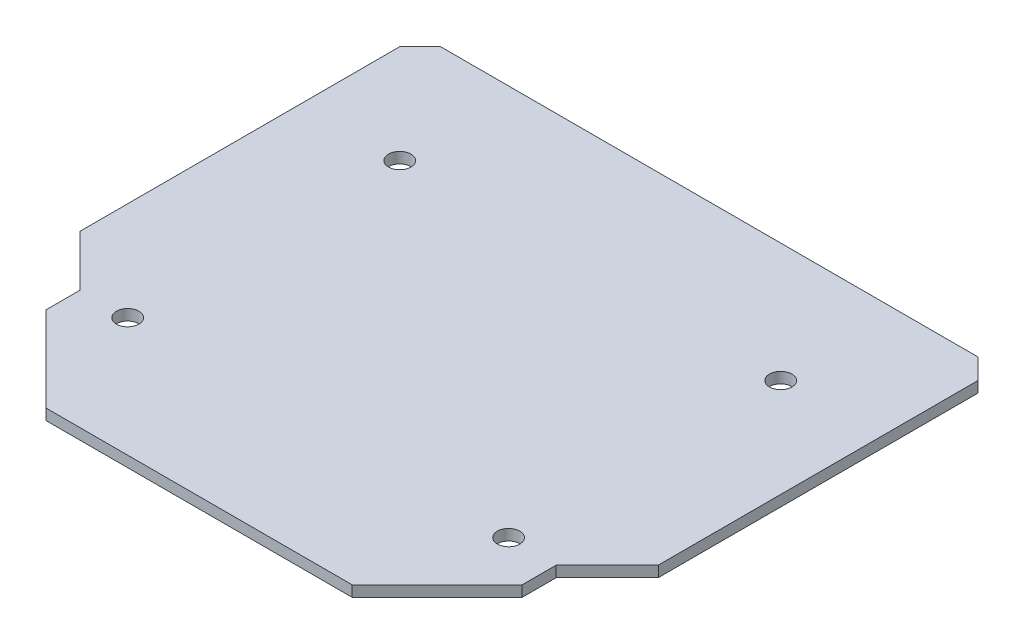
ISO-10303-21;
HEADER;
FILE_DESCRIPTION(('STEP AP214'),'2;1');
FILE_NAME('part.step','',(''),(''),'','','');
FILE_SCHEMA(('AUTOMOTIVE_DESIGN { 1 0 10303 214 1 1 1 1 }'));
ENDSEC;
DATA;
#1=APPLICATION_CONTEXT('core data for automotive mechanical design processes');
#2=APPLICATION_PROTOCOL_DEFINITION('international standard','automotive_design',2000,#1);
#3=PRODUCT_CONTEXT('',#1,'mechanical');
#4=PRODUCT('Part','Part','',(#3));
#5=PRODUCT_RELATED_PRODUCT_CATEGORY('part','',(#4));
#6=PRODUCT_DEFINITION_FORMATION('','',#4);
#7=PRODUCT_DEFINITION_CONTEXT('part definition',#1,'design');
#8=PRODUCT_DEFINITION('design','',#6,#7);
#9=PRODUCT_DEFINITION_SHAPE('','',#8);
#10=(LENGTH_UNIT() NAMED_UNIT(*) SI_UNIT(.MILLI.,.METRE.));
#11=(NAMED_UNIT(*) PLANE_ANGLE_UNIT() SI_UNIT($,.RADIAN.));
#12=(NAMED_UNIT(*) SI_UNIT($,.STERADIAN.) SOLID_ANGLE_UNIT());
#13=UNCERTAINTY_MEASURE_WITH_UNIT(LENGTH_MEASURE(1.E-05),#10,'distance_accuracy_value','');
#14=(GEOMETRIC_REPRESENTATION_CONTEXT(3) GLOBAL_UNCERTAINTY_ASSIGNED_CONTEXT((#13)) GLOBAL_UNIT_ASSIGNED_CONTEXT((#10,
#11,#12)) REPRESENTATION_CONTEXT('',''));
#15=CARTESIAN_POINT('',(0.,0.,0.));
#16=DIRECTION('',(0.,0.,1.));
#17=DIRECTION('',(1.,0.,0.));
#18=AXIS2_PLACEMENT_3D('',#15,#16,#17);
#19=CARTESIAN_POINT('',(42.5,1.6,37.5));
#20=DIRECTION('',(-1.,0.,0.));
#21=DIRECTION('',(0.,0.,1.));
#22=AXIS2_PLACEMENT_3D('',#19,#20,#21);
#23=PLANE('',#22);
#24=DIRECTION('',(0.,1.,0.));
#25=VECTOR('',#24,1.);
#26=CARTESIAN_POINT('',(42.5,-0.000999999999999916,12.4999999999999));
#27=LINE('',#26,#25);
#28=CARTESIAN_POINT('',(42.5,0.,12.4999999999999));
#29=VERTEX_POINT('',#28);
#30=CARTESIAN_POINT('',(42.5,1.6,12.4999999999999));
#31=VERTEX_POINT('',#30);
#32=EDGE_CURVE('E124',#29,#31,#27,.T.);
#33=ORIENTED_EDGE('',*,*,#32,.F.);
#34=DIRECTION('',(0.,0.,-1.));
#35=VECTOR('',#34,1.);
#36=CARTESIAN_POINT('',(42.5,0.,37.5));
#37=LINE('',#36,#35);
#38=CARTESIAN_POINT('',(42.5,0.,-34.5));
#39=VERTEX_POINT('',#38);
#40=EDGE_CURVE('E163',#29,#39,#37,.T.);
#41=ORIENTED_EDGE('',*,*,#40,.T.);
#42=DIRECTION('',(0.,1.,0.));
#43=VECTOR('',#42,1.);
#44=CARTESIAN_POINT('',(42.5,1.6,-34.5));
#45=LINE('',#44,#43);
#46=CARTESIAN_POINT('',(42.5,1.6,-34.5));
#47=VERTEX_POINT('',#46);
#48=EDGE_CURVE('E142',#39,#47,#45,.T.);
#49=ORIENTED_EDGE('',*,*,#48,.T.);
#50=DIRECTION('',(0.,0.,-1.));
#51=VECTOR('',#50,1.);
#52=CARTESIAN_POINT('',(42.5,1.6,37.5));
#53=LINE('',#52,#51);
#54=EDGE_CURVE('E137',#31,#47,#53,.T.);
#55=ORIENTED_EDGE('',*,*,#54,.F.);
#56=EDGE_LOOP('',(#33,#41,#49,#55));
#57=FACE_BOUND('',#56,.T.);
#58=ADVANCED_FACE('F34',(#57),#23,.F.);
#59=CARTESIAN_POINT('',(0.,1.6,0.));
#60=DIRECTION('',(0.,-1.,0.));
#61=DIRECTION('',(0.,0.,-1.));
#62=AXIS2_PLACEMENT_3D('',#59,#60,#61);
#63=PLANE('',#62);
#64=CARTESIAN_POINT('',(-28.,1.6,-20.));
#65=DIRECTION('',(0.,1.,0.));
#66=DIRECTION('',(0.,0.,1.));
#67=AXIS2_PLACEMENT_3D('',#64,#65,#66);
#68=CIRCLE('',#67,1.65);
#69=CARTESIAN_POINT('',(-28.,1.6,-18.35));
#70=VERTEX_POINT('',#69);
#71=EDGE_CURVE('E166',#70,#70,#68,.T.);
#72=ORIENTED_EDGE('',*,*,#71,.F.);
#73=EDGE_LOOP('',(#72));
#74=FACE_BOUND('',#73,.T.);
#75=CARTESIAN_POINT('',(28.,1.6,20.));
#76=DIRECTION('',(0.,1.,0.));
#77=DIRECTION('',(0.,0.,1.));
#78=AXIS2_PLACEMENT_3D('',#75,#76,#77);
#79=CIRCLE('',#78,1.65);
#80=CARTESIAN_POINT('',(28.,1.6,21.65));
#81=VERTEX_POINT('',#80);
#82=EDGE_CURVE('E237',#81,#81,#79,.T.);
#83=ORIENTED_EDGE('',*,*,#82,.F.);
#84=EDGE_LOOP('',(#83));
#85=FACE_BOUND('',#84,.T.);
#86=CARTESIAN_POINT('',(28.,1.6,-20.));
#87=DIRECTION('',(0.,1.,0.));
#88=DIRECTION('',(0.,0.,1.));
#89=AXIS2_PLACEMENT_3D('',#86,#87,#88);
#90=CIRCLE('',#89,1.65);
#91=CARTESIAN_POINT('',(28.,1.6,-18.35));
#92=VERTEX_POINT('',#91);
#93=EDGE_CURVE('E249',#92,#92,#90,.T.);
#94=ORIENTED_EDGE('',*,*,#93,.F.);
#95=EDGE_LOOP('',(#94));
#96=FACE_BOUND('',#95,.T.);
#97=CARTESIAN_POINT('',(-28.,1.6,20.));
#98=DIRECTION('',(0.,1.,0.));
#99=DIRECTION('',(0.,0.,1.));
#100=AXIS2_PLACEMENT_3D('',#97,#98,#99);
#101=CIRCLE('',#100,1.65);
#102=CARTESIAN_POINT('',(-28.,1.6,21.65));
#103=VERTEX_POINT('',#102);
#104=EDGE_CURVE('E243',#103,#103,#101,.T.);
#105=ORIENTED_EDGE('',*,*,#104,.F.);
#106=EDGE_LOOP('',(#105));
#107=FACE_BOUND('',#106,.T.);
#108=DIRECTION('',(0.,0.,-1.));
#109=VECTOR('',#108,1.);
#110=CARTESIAN_POINT('',(35.,1.6,24.9999999999999));
#111=LINE('',#110,#109);
#112=CARTESIAN_POINT('',(35.,1.6,24.9999999999999));
#113=VERTEX_POINT('',#112);
#114=CARTESIAN_POINT('',(35.,1.6,19.9999999999999));
#115=VERTEX_POINT('',#114);
#116=EDGE_CURVE('E49',#113,#115,#111,.T.);
#117=ORIENTED_EDGE('',*,*,#116,.T.);
#118=DIRECTION('',(0.707106781186547,0.,-0.707106781186548));
#119=VECTOR('',#118,1.);
#120=CARTESIAN_POINT('',(35.,1.6,19.9999999999999));
#121=LINE('',#120,#119);
#122=EDGE_CURVE('E127',#115,#31,#121,.T.);
#123=ORIENTED_EDGE('',*,*,#122,.T.);
#124=ORIENTED_EDGE('',*,*,#54,.T.);
#125=DIRECTION('',(0.707106781186546,0.,0.707106781186549));
#126=VECTOR('',#125,1.);
#127=CARTESIAN_POINT('',(39.5,1.6,-37.5));
#128=LINE('',#127,#126);
#129=CARTESIAN_POINT('',(39.5,1.6,-37.5));
#130=VERTEX_POINT('',#129);
#131=EDGE_CURVE('E183',#47,#130,#128,.F.);
#132=ORIENTED_EDGE('',*,*,#131,.T.);
#133=DIRECTION('',(-1.,0.,0.));
#134=VECTOR('',#133,1.);
#135=CARTESIAN_POINT('',(-42.5,1.6,-37.5));
#136=LINE('',#135,#134);
#137=CARTESIAN_POINT('',(-39.5,1.6,-37.5));
#138=VERTEX_POINT('',#137);
#139=EDGE_CURVE('E144',#130,#138,#136,.T.);
#140=ORIENTED_EDGE('',*,*,#139,.T.);
#141=DIRECTION('',(0.707106781186549,0.,-0.707106781186546));
#142=VECTOR('',#141,1.);
#143=CARTESIAN_POINT('',(-42.5,1.6,-34.5));
#144=LINE('',#143,#142);
#145=CARTESIAN_POINT('',(-42.5,1.6,-34.5));
#146=VERTEX_POINT('',#145);
#147=EDGE_CURVE('E181',#138,#146,#144,.F.);
#148=ORIENTED_EDGE('',*,*,#147,.T.);
#149=DIRECTION('',(0.,0.,1.));
#150=VECTOR('',#149,1.);
#151=CARTESIAN_POINT('',(-42.5,1.6,37.5));
#152=LINE('',#151,#150);
#153=CARTESIAN_POINT('',(-42.5,1.6,12.4999999999999));
#154=VERTEX_POINT('',#153);
#155=EDGE_CURVE('E148',#146,#154,#152,.T.);
#156=ORIENTED_EDGE('',*,*,#155,.T.);
#157=DIRECTION('',(-0.707106781186547,0.,-0.707106781186548));
#158=VECTOR('',#157,1.);
#159=CARTESIAN_POINT('',(-35.,1.6,19.9999999999999));
#160=LINE('',#159,#158);
#161=CARTESIAN_POINT('',(-35.,1.6,19.9999999999999));
#162=VERTEX_POINT('',#161);
#163=EDGE_CURVE('E227',#162,#154,#160,.T.);
#164=ORIENTED_EDGE('',*,*,#163,.F.);
#165=DIRECTION('',(0.,0.,-1.));
#166=VECTOR('',#165,1.);
#167=CARTESIAN_POINT('',(-35.,1.6,24.9999999999999));
#168=LINE('',#167,#166);
#169=CARTESIAN_POINT('',(-35.,1.6,24.9999999999999));
#170=VERTEX_POINT('',#169);
#171=EDGE_CURVE('E203',#170,#162,#168,.T.);
#172=ORIENTED_EDGE('',*,*,#171,.F.);
#173=DIRECTION('',(-0.707106781186546,0.,-0.707106781186549));
#174=VECTOR('',#173,1.);
#175=CARTESIAN_POINT('',(-22.5,1.6,37.5));
#176=LINE('',#175,#174);
#177=CARTESIAN_POINT('',(-22.5,1.6,37.5));
#178=VERTEX_POINT('',#177);
#179=EDGE_CURVE('E42',#170,#178,#176,.F.);
#180=ORIENTED_EDGE('',*,*,#179,.T.);
#181=DIRECTION('',(1.,0.,0.));
#182=VECTOR('',#181,1.);
#183=CARTESIAN_POINT('',(-42.5,1.6,37.5));
#184=LINE('',#183,#182);
#185=CARTESIAN_POINT('',(22.4999999999999,1.6,37.5));
#186=VERTEX_POINT('',#185);
#187=EDGE_CURVE('E159',#178,#186,#184,.T.);
#188=ORIENTED_EDGE('',*,*,#187,.T.);
#189=DIRECTION('',(-0.707106781186549,0.,0.707106781186546));
#190=VECTOR('',#189,1.);
#191=CARTESIAN_POINT('',(42.5,1.6,17.5));
#192=LINE('',#191,#190);
#193=EDGE_CURVE('E11',#186,#113,#192,.F.);
#194=ORIENTED_EDGE('',*,*,#193,.T.);
#195=EDGE_LOOP('',(#117,#123,#124,#132,#140,#148,#156,#164,#172,#180,#188,#194));
#196=FACE_BOUND('',#195,.T.);
#197=ADVANCED_FACE('F136',(#74,#85,#96,#107,#196),#63,.F.);
#198=CARTESIAN_POINT('',(0.,0.,0.));
#199=DIRECTION('',(0.,-1.,0.));
#200=DIRECTION('',(0.,0.,-1.));
#201=AXIS2_PLACEMENT_3D('',#198,#199,#200);
#202=PLANE('',#201);
#203=CARTESIAN_POINT('',(-28.,0.,20.));
#204=DIRECTION('',(0.,-1.,0.));
#205=DIRECTION('',(0.,0.,-1.));
#206=AXIS2_PLACEMENT_3D('',#203,#204,#205);
#207=CIRCLE('',#206,1.65);
#208=CARTESIAN_POINT('',(-28.,0.,18.35));
#209=VERTEX_POINT('',#208);
#210=EDGE_CURVE('E246',#209,#209,#207,.F.);
#211=ORIENTED_EDGE('',*,*,#210,.T.);
#212=EDGE_LOOP('',(#211));
#213=FACE_BOUND('',#212,.T.);
#214=CARTESIAN_POINT('',(28.,0.,-20.));
#215=DIRECTION('',(0.,-1.,0.));
#216=DIRECTION('',(0.,0.,-1.));
#217=AXIS2_PLACEMENT_3D('',#214,#215,#216);
#218=CIRCLE('',#217,1.65);
#219=CARTESIAN_POINT('',(28.,0.,-21.65));
#220=VERTEX_POINT('',#219);
#221=EDGE_CURVE('E240',#220,#220,#218,.F.);
#222=ORIENTED_EDGE('',*,*,#221,.T.);
#223=EDGE_LOOP('',(#222));
#224=FACE_BOUND('',#223,.T.);
#225=CARTESIAN_POINT('',(28.,0.,20.));
#226=DIRECTION('',(0.,-1.,0.));
#227=DIRECTION('',(0.,0.,-1.));
#228=AXIS2_PLACEMENT_3D('',#225,#226,#227);
#229=CIRCLE('',#228,1.65);
#230=CARTESIAN_POINT('',(28.,0.,18.35));
#231=VERTEX_POINT('',#230);
#232=EDGE_CURVE('E236',#231,#231,#229,.F.);
#233=ORIENTED_EDGE('',*,*,#232,.T.);
#234=EDGE_LOOP('',(#233));
#235=FACE_BOUND('',#234,.T.);
#236=CARTESIAN_POINT('',(-28.,0.,-20.));
#237=DIRECTION('',(0.,-1.,0.));
#238=DIRECTION('',(0.,0.,-1.));
#239=AXIS2_PLACEMENT_3D('',#236,#237,#238);
#240=CIRCLE('',#239,1.65);
#241=CARTESIAN_POINT('',(-28.,0.,-21.65));
#242=VERTEX_POINT('',#241);
#243=EDGE_CURVE('E154',#242,#242,#240,.F.);
#244=ORIENTED_EDGE('',*,*,#243,.T.);
#245=EDGE_LOOP('',(#244));
#246=FACE_BOUND('',#245,.T.);
#247=DIRECTION('',(0.707106781186547,0.,-0.707106781186548));
#248=VECTOR('',#247,1.);
#249=CARTESIAN_POINT('',(35.,0.,19.9999999999999));
#250=LINE('',#249,#248);
#251=CARTESIAN_POINT('',(35.,0.,19.9999999999999));
#252=VERTEX_POINT('',#251);
#253=EDGE_CURVE('E129',#252,#29,#250,.T.);
#254=ORIENTED_EDGE('',*,*,#253,.F.);
#255=DIRECTION('',(0.,0.,-1.));
#256=VECTOR('',#255,1.);
#257=CARTESIAN_POINT('',(35.,0.,24.9999999999999));
#258=LINE('',#257,#256);
#259=CARTESIAN_POINT('',(35.,0.,24.9999999999999));
#260=VERTEX_POINT('',#259);
#261=EDGE_CURVE('E139',#260,#252,#258,.T.);
#262=ORIENTED_EDGE('',*,*,#261,.F.);
#263=DIRECTION('',(0.707106781186549,0.,-0.707106781186546));
#264=VECTOR('',#263,1.);
#265=CARTESIAN_POINT('',(29.9999999999999,0.,30.));
#266=LINE('',#265,#264);
#267=CARTESIAN_POINT('',(22.4999999999999,0.,37.5));
#268=VERTEX_POINT('',#267);
#269=EDGE_CURVE('E191',#260,#268,#266,.F.);
#270=ORIENTED_EDGE('',*,*,#269,.T.);
#271=DIRECTION('',(1.,0.,0.));
#272=VECTOR('',#271,1.);
#273=CARTESIAN_POINT('',(-42.5,0.,37.5));
#274=LINE('',#273,#272);
#275=CARTESIAN_POINT('',(-22.5,0.,37.5));
#276=VERTEX_POINT('',#275);
#277=EDGE_CURVE('E145',#276,#268,#274,.T.);
#278=ORIENTED_EDGE('',*,*,#277,.F.);
#279=DIRECTION('',(0.707106781186546,0.,0.707106781186549));
#280=VECTOR('',#279,1.);
#281=CARTESIAN_POINT('',(-30.,0.,29.9999999999999));
#282=LINE('',#281,#280);
#283=CARTESIAN_POINT('',(-35.,0.,25.));
#284=VERTEX_POINT('',#283);
#285=EDGE_CURVE('E188',#276,#284,#282,.F.);
#286=ORIENTED_EDGE('',*,*,#285,.T.);
#287=DIRECTION('',(0.,0.,-1.));
#288=VECTOR('',#287,1.);
#289=CARTESIAN_POINT('',(-35.,0.,24.9999999999999));
#290=LINE('',#289,#288);
#291=CARTESIAN_POINT('',(-35.,0.,19.9999999999999));
#292=VERTEX_POINT('',#291);
#293=EDGE_CURVE('E57',#284,#292,#290,.T.);
#294=ORIENTED_EDGE('',*,*,#293,.T.);
#295=DIRECTION('',(-0.707106781186547,0.,-0.707106781186548));
#296=VECTOR('',#295,1.);
#297=CARTESIAN_POINT('',(-35.,0.,19.9999999999999));
#298=LINE('',#297,#296);
#299=CARTESIAN_POINT('',(-42.5,0.,12.4999999999999));
#300=VERTEX_POINT('',#299);
#301=EDGE_CURVE('E220',#292,#300,#298,.T.);
#302=ORIENTED_EDGE('',*,*,#301,.T.);
#303=DIRECTION('',(0.,0.,1.));
#304=VECTOR('',#303,1.);
#305=CARTESIAN_POINT('',(-42.5,0.,37.5));
#306=LINE('',#305,#304);
#307=CARTESIAN_POINT('',(-42.5,0.,-34.5));
#308=VERTEX_POINT('',#307);
#309=EDGE_CURVE('E151',#308,#300,#306,.T.);
#310=ORIENTED_EDGE('',*,*,#309,.F.);
#311=DIRECTION('',(-0.707106781186549,0.,0.707106781186546));
#312=VECTOR('',#311,1.);
#313=CARTESIAN_POINT('',(-38.4999999999999,0.,-38.5000000000001));
#314=LINE('',#313,#312);
#315=CARTESIAN_POINT('',(-39.5,0.,-37.5));
#316=VERTEX_POINT('',#315);
#317=EDGE_CURVE('E175',#308,#316,#314,.F.);
#318=ORIENTED_EDGE('',*,*,#317,.T.);
#319=DIRECTION('',(-1.,0.,0.));
#320=VECTOR('',#319,1.);
#321=CARTESIAN_POINT('',(-42.5,0.,-37.5));
#322=LINE('',#321,#320);
#323=CARTESIAN_POINT('',(39.5,0.,-37.5));
#324=VERTEX_POINT('',#323);
#325=EDGE_CURVE('E165',#324,#316,#322,.T.);
#326=ORIENTED_EDGE('',*,*,#325,.F.);
#327=DIRECTION('',(-0.707106781186546,0.,-0.707106781186549));
#328=VECTOR('',#327,1.);
#329=CARTESIAN_POINT('',(38.5000000000001,0.,-38.4999999999999));
#330=LINE('',#329,#328);
#331=EDGE_CURVE('E177',#324,#39,#330,.F.);
#332=ORIENTED_EDGE('',*,*,#331,.T.);
#333=ORIENTED_EDGE('',*,*,#40,.F.);
#334=EDGE_LOOP('',(#254,#262,#270,#278,#286,#294,#302,#310,#318,#326,#332,#333));
#335=FACE_BOUND('',#334,.T.);
#336=ADVANCED_FACE('F212',(#213,#224,#235,#246,#335),#202,.T.);
#337=CARTESIAN_POINT('',(42.5,1.6,17.5));
#338=DIRECTION('',(-0.707106781186546,0.,-0.707106781186549));
#339=DIRECTION('',(0.,-1.,0.));
#340=AXIS2_PLACEMENT_3D('',#337,#338,#339);
#341=PLANE('',#340);
#342=ORIENTED_EDGE('',*,*,#269,.F.);
#343=DIRECTION('',(0.,1.,0.));
#344=VECTOR('',#343,1.);
#345=CARTESIAN_POINT('',(35.,-0.000999999999999916,24.9999999999999));
#346=LINE('',#345,#344);
#347=EDGE_CURVE('E218',#260,#113,#346,.T.);
#348=ORIENTED_EDGE('',*,*,#347,.T.);
#349=ORIENTED_EDGE('',*,*,#193,.F.);
#350=DIRECTION('',(0.,1.,0.));
#351=VECTOR('',#350,1.);
#352=CARTESIAN_POINT('',(22.4999999999999,1.6,37.5));
#353=LINE('',#352,#351);
#354=EDGE_CURVE('E196',#268,#186,#353,.T.);
#355=ORIENTED_EDGE('',*,*,#354,.F.);
#356=EDGE_LOOP('',(#342,#348,#349,#355));
#357=FACE_BOUND('',#356,.T.);
#358=ADVANCED_FACE('F217',(#357),#341,.F.);
#359=CARTESIAN_POINT('',(-42.5,1.6,-37.5));
#360=DIRECTION('',(0.,0.,1.));
#361=DIRECTION('',(1.,0.,0.));
#362=AXIS2_PLACEMENT_3D('',#359,#360,#361);
#363=PLANE('',#362);
#364=ORIENTED_EDGE('',*,*,#139,.F.);
#365=DIRECTION('',(0.,-1.,0.));
#366=VECTOR('',#365,1.);
#367=CARTESIAN_POINT('',(39.5,1.6,-37.5));
#368=LINE('',#367,#366);
#369=EDGE_CURVE('E172',#130,#324,#368,.T.);
#370=ORIENTED_EDGE('',*,*,#369,.T.);
#371=ORIENTED_EDGE('',*,*,#325,.T.);
#372=DIRECTION('',(0.,1.,0.));
#373=VECTOR('',#372,1.);
#374=CARTESIAN_POINT('',(-39.5,1.6,-37.5));
#375=LINE('',#374,#373);
#376=EDGE_CURVE('E162',#316,#138,#375,.T.);
#377=ORIENTED_EDGE('',*,*,#376,.T.);
#378=EDGE_LOOP('',(#364,#370,#371,#377));
#379=FACE_BOUND('',#378,.T.);
#380=ADVANCED_FACE('F285',(#379),#363,.F.);
#381=CARTESIAN_POINT('',(-42.5,1.6,37.5));
#382=DIRECTION('',(1.,0.,0.));
#383=DIRECTION('',(0.,0.,-1.));
#384=AXIS2_PLACEMENT_3D('',#381,#382,#383);
#385=PLANE('',#384);
#386=ORIENTED_EDGE('',*,*,#309,.T.);
#387=DIRECTION('',(0.,1.,0.));
#388=VECTOR('',#387,1.);
#389=CARTESIAN_POINT('',(-42.5,-0.000999999999999916,12.4999999999999));
#390=LINE('',#389,#388);
#391=EDGE_CURVE('E229',#300,#154,#390,.T.);
#392=ORIENTED_EDGE('',*,*,#391,.T.);
#393=ORIENTED_EDGE('',*,*,#155,.F.);
#394=DIRECTION('',(0.,-1.,0.));
#395=VECTOR('',#394,1.);
#396=CARTESIAN_POINT('',(-42.5,1.6,-34.5));
#397=LINE('',#396,#395);
#398=EDGE_CURVE('E185',#146,#308,#397,.T.);
#399=ORIENTED_EDGE('',*,*,#398,.T.);
#400=EDGE_LOOP('',(#386,#392,#393,#399));
#401=FACE_BOUND('',#400,.T.);
#402=ADVANCED_FACE('F272',(#401),#385,.F.);
#403=CARTESIAN_POINT('',(-42.5,1.6,37.5));
#404=DIRECTION('',(0.,0.,-1.));
#405=DIRECTION('',(-1.,0.,0.));
#406=AXIS2_PLACEMENT_3D('',#403,#404,#405);
#407=PLANE('',#406);
#408=ORIENTED_EDGE('',*,*,#277,.T.);
#409=ORIENTED_EDGE('',*,*,#354,.T.);
#410=ORIENTED_EDGE('',*,*,#187,.F.);
#411=DIRECTION('',(0.,-1.,0.));
#412=VECTOR('',#411,1.);
#413=CARTESIAN_POINT('',(-22.5,1.6,37.5));
#414=LINE('',#413,#412);
#415=EDGE_CURVE('E193',#178,#276,#414,.T.);
#416=ORIENTED_EDGE('',*,*,#415,.T.);
#417=EDGE_LOOP('',(#408,#409,#410,#416));
#418=FACE_BOUND('',#417,.T.);
#419=ADVANCED_FACE('F207',(#418),#407,.F.);
#420=CARTESIAN_POINT('',(-28.,-0.000999999999999916,-20.));
#421=DIRECTION('',(0.,1.,0.));
#422=DIRECTION('',(0.,0.,1.));
#423=AXIS2_PLACEMENT_3D('',#420,#421,#422);
#424=CYLINDRICAL_SURFACE('',#423,1.65);
#425=ORIENTED_EDGE('',*,*,#243,.F.);
#426=EDGE_LOOP('',(#425));
#427=FACE_BOUND('',#426,.T.);
#428=ORIENTED_EDGE('',*,*,#71,.T.);
#429=EDGE_LOOP('',(#428));
#430=FACE_BOUND('',#429,.T.);
#431=ADVANCED_FACE('F260',(#427,#430),#424,.F.);
#432=CARTESIAN_POINT('',(28.,-0.000999999999999916,20.));
#433=DIRECTION('',(0.,1.,0.));
#434=DIRECTION('',(0.,0.,1.));
#435=AXIS2_PLACEMENT_3D('',#432,#433,#434);
#436=CYLINDRICAL_SURFACE('',#435,1.65);
#437=ORIENTED_EDGE('',*,*,#232,.F.);
#438=EDGE_LOOP('',(#437));
#439=FACE_BOUND('',#438,.T.);
#440=ORIENTED_EDGE('',*,*,#82,.T.);
#441=EDGE_LOOP('',(#440));
#442=FACE_BOUND('',#441,.T.);
#443=ADVANCED_FACE('F262',(#439,#442),#436,.F.);
#444=CARTESIAN_POINT('',(28.,-0.000999999999999916,-20.));
#445=DIRECTION('',(0.,1.,0.));
#446=DIRECTION('',(0.,0.,1.));
#447=AXIS2_PLACEMENT_3D('',#444,#445,#446);
#448=CYLINDRICAL_SURFACE('',#447,1.65);
#449=ORIENTED_EDGE('',*,*,#221,.F.);
#450=EDGE_LOOP('',(#449));
#451=FACE_BOUND('',#450,.T.);
#452=ORIENTED_EDGE('',*,*,#93,.T.);
#453=EDGE_LOOP('',(#452));
#454=FACE_BOUND('',#453,.T.);
#455=ADVANCED_FACE('F268',(#451,#454),#448,.F.);
#456=CARTESIAN_POINT('',(-28.,-0.000999999999999916,20.));
#457=DIRECTION('',(0.,1.,0.));
#458=DIRECTION('',(0.,0.,1.));
#459=AXIS2_PLACEMENT_3D('',#456,#457,#458);
#460=CYLINDRICAL_SURFACE('',#459,1.65);
#461=ORIENTED_EDGE('',*,*,#210,.F.);
#462=EDGE_LOOP('',(#461));
#463=FACE_BOUND('',#462,.T.);
#464=ORIENTED_EDGE('',*,*,#104,.T.);
#465=EDGE_LOOP('',(#464));
#466=FACE_BOUND('',#465,.T.);
#467=ADVANCED_FACE('F291',(#463,#466),#460,.F.);
#468=CARTESIAN_POINT('',(39.5,1.6,-37.5));
#469=DIRECTION('',(-0.707106781186549,0.,0.707106781186546));
#470=DIRECTION('',(0.,-1.,0.));
#471=AXIS2_PLACEMENT_3D('',#468,#469,#470);
#472=PLANE('',#471);
#473=ORIENTED_EDGE('',*,*,#131,.F.);
#474=ORIENTED_EDGE('',*,*,#48,.F.);
#475=ORIENTED_EDGE('',*,*,#331,.F.);
#476=ORIENTED_EDGE('',*,*,#369,.F.);
#477=EDGE_LOOP('',(#473,#474,#475,#476));
#478=FACE_BOUND('',#477,.T.);
#479=ADVANCED_FACE('F287',(#478),#472,.F.);
#480=CARTESIAN_POINT('',(-42.5,1.6,-34.5));
#481=DIRECTION('',(0.707106781186546,0.,0.707106781186549));
#482=DIRECTION('',(0.,-1.,0.));
#483=AXIS2_PLACEMENT_3D('',#480,#481,#482);
#484=PLANE('',#483);
#485=ORIENTED_EDGE('',*,*,#147,.F.);
#486=ORIENTED_EDGE('',*,*,#376,.F.);
#487=ORIENTED_EDGE('',*,*,#317,.F.);
#488=ORIENTED_EDGE('',*,*,#398,.F.);
#489=EDGE_LOOP('',(#485,#486,#487,#488));
#490=FACE_BOUND('',#489,.T.);
#491=ADVANCED_FACE('F290',(#490),#484,.F.);
#492=CARTESIAN_POINT('',(-22.5,1.6,37.5));
#493=DIRECTION('',(0.707106781186549,0.,-0.707106781186546));
#494=DIRECTION('',(0.,-1.,0.));
#495=AXIS2_PLACEMENT_3D('',#492,#493,#494);
#496=PLANE('',#495);
#497=DIRECTION('',(0.,1.,0.));
#498=VECTOR('',#497,1.);
#499=CARTESIAN_POINT('',(-35.,-0.000999999999999916,24.9999999999999));
#500=LINE('',#499,#498);
#501=EDGE_CURVE('E210',#284,#170,#500,.T.);
#502=ORIENTED_EDGE('',*,*,#501,.F.);
#503=ORIENTED_EDGE('',*,*,#285,.F.);
#504=ORIENTED_EDGE('',*,*,#415,.F.);
#505=ORIENTED_EDGE('',*,*,#179,.F.);
#506=EDGE_LOOP('',(#502,#503,#504,#505));
#507=FACE_BOUND('',#506,.T.);
#508=ADVANCED_FACE('F36',(#507),#496,.F.);
#509=CARTESIAN_POINT('',(-35.,-0.000999999999999916,19.9999999999999));
#510=DIRECTION('',(0.707106781186548,0.,-0.707106781186547));
#511=DIRECTION('',(-0.707106781186547,0.,-0.707106781186548));
#512=AXIS2_PLACEMENT_3D('',#509,#510,#511);
#513=PLANE('',#512);
#514=DIRECTION('',(0.,1.,0.));
#515=VECTOR('',#514,1.);
#516=CARTESIAN_POINT('',(-35.,-0.000999999999999916,19.9999999999999));
#517=LINE('',#516,#515);
#518=EDGE_CURVE('E232',#292,#162,#517,.T.);
#519=ORIENTED_EDGE('',*,*,#518,.T.);
#520=ORIENTED_EDGE('',*,*,#163,.T.);
#521=ORIENTED_EDGE('',*,*,#391,.F.);
#522=ORIENTED_EDGE('',*,*,#301,.F.);
#523=EDGE_LOOP('',(#519,#520,#521,#522));
#524=FACE_BOUND('',#523,.T.);
#525=ADVANCED_FACE('F316',(#524),#513,.F.);
#526=CARTESIAN_POINT('',(-35.,-0.000999999999999916,24.9999999999999));
#527=DIRECTION('',(1.,0.,0.));
#528=DIRECTION('',(0.,0.,-1.));
#529=AXIS2_PLACEMENT_3D('',#526,#527,#528);
#530=PLANE('',#529);
#531=ORIENTED_EDGE('',*,*,#501,.T.);
#532=ORIENTED_EDGE('',*,*,#171,.T.);
#533=ORIENTED_EDGE('',*,*,#518,.F.);
#534=ORIENTED_EDGE('',*,*,#293,.F.);
#535=EDGE_LOOP('',(#531,#532,#533,#534));
#536=FACE_BOUND('',#535,.T.);
#537=ADVANCED_FACE('F317',(#536),#530,.F.);
#538=CARTESIAN_POINT('',(35.,-0.000999999999999916,24.9999999999999));
#539=DIRECTION('',(1.,0.,0.));
#540=DIRECTION('',(0.,0.,-1.));
#541=AXIS2_PLACEMENT_3D('',#538,#539,#540);
#542=PLANE('',#541);
#543=ORIENTED_EDGE('',*,*,#261,.T.);
#544=DIRECTION('',(0.,1.,0.));
#545=VECTOR('',#544,1.);
#546=CARTESIAN_POINT('',(35.,-0.000999999999999916,19.9999999999999));
#547=LINE('',#546,#545);
#548=EDGE_CURVE('E133',#252,#115,#547,.T.);
#549=ORIENTED_EDGE('',*,*,#548,.T.);
#550=ORIENTED_EDGE('',*,*,#116,.F.);
#551=ORIENTED_EDGE('',*,*,#347,.F.);
#552=EDGE_LOOP('',(#543,#549,#550,#551));
#553=FACE_BOUND('',#552,.T.);
#554=ADVANCED_FACE('F324',(#553),#542,.T.);
#555=CARTESIAN_POINT('',(35.,-0.000999999999999916,19.9999999999999));
#556=DIRECTION('',(0.707106781186548,0.,0.707106781186547));
#557=DIRECTION('',(0.707106781186547,0.,-0.707106781186548));
#558=AXIS2_PLACEMENT_3D('',#555,#556,#557);
#559=PLANE('',#558);
#560=ORIENTED_EDGE('',*,*,#253,.T.);
#561=ORIENTED_EDGE('',*,*,#32,.T.);
#562=ORIENTED_EDGE('',*,*,#122,.F.);
#563=ORIENTED_EDGE('',*,*,#548,.F.);
#564=EDGE_LOOP('',(#560,#561,#562,#563));
#565=FACE_BOUND('',#564,.T.);
#566=ADVANCED_FACE('F126',(#565),#559,.T.);
#567=CLOSED_SHELL('',(#58,#197,#336,#358,#380,#402,#419,#431,#443,#455,#467,#479,#491,#508,#525,
#537,#554,#566));
#568=MANIFOLD_SOLID_BREP('B2',#567);
#569=ADVANCED_BREP_SHAPE_REPRESENTATION('',(#18,#568),#14);
#570=SHAPE_DEFINITION_REPRESENTATION(#9,#569);
ENDSEC;
END-ISO-10303-21;
